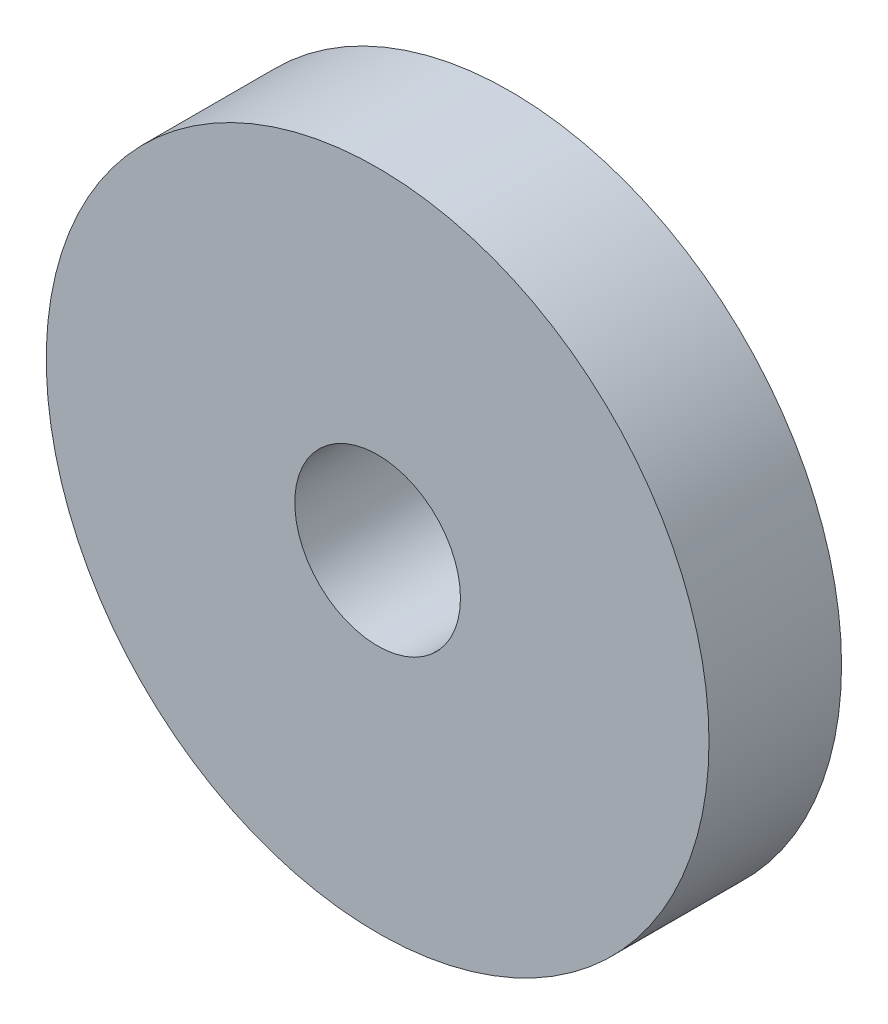
ISO-10303-21;
HEADER;
FILE_DESCRIPTION(('STEP AP214'),'2;1');
FILE_NAME('part.step','',(''),(''),'','','');
FILE_SCHEMA(('AUTOMOTIVE_DESIGN { 1 0 10303 214 1 1 1 1 }'));
ENDSEC;
DATA;
#1=APPLICATION_CONTEXT('core data for automotive mechanical design processes');
#2=APPLICATION_PROTOCOL_DEFINITION('international standard','automotive_design',2000,#1);
#3=PRODUCT_CONTEXT('',#1,'mechanical');
#4=PRODUCT('Part','Part','',(#3));
#5=PRODUCT_RELATED_PRODUCT_CATEGORY('part','',(#4));
#6=PRODUCT_DEFINITION_FORMATION('','',#4);
#7=PRODUCT_DEFINITION_CONTEXT('part definition',#1,'design');
#8=PRODUCT_DEFINITION('design','',#6,#7);
#9=PRODUCT_DEFINITION_SHAPE('','',#8);
#10=(LENGTH_UNIT() NAMED_UNIT(*) SI_UNIT(.MILLI.,.METRE.));
#11=(NAMED_UNIT(*) PLANE_ANGLE_UNIT() SI_UNIT($,.RADIAN.));
#12=(NAMED_UNIT(*) SI_UNIT($,.STERADIAN.) SOLID_ANGLE_UNIT());
#13=UNCERTAINTY_MEASURE_WITH_UNIT(LENGTH_MEASURE(1.E-05),#10,'distance_accuracy_value','');
#14=(GEOMETRIC_REPRESENTATION_CONTEXT(3) GLOBAL_UNCERTAINTY_ASSIGNED_CONTEXT((#13)) GLOBAL_UNIT_ASSIGNED_CONTEXT((#10,
#11,#12)) REPRESENTATION_CONTEXT('',''));
#15=CARTESIAN_POINT('',(0.,0.,0.));
#16=DIRECTION('',(0.,0.,1.));
#17=DIRECTION('',(1.,0.,0.));
#18=AXIS2_PLACEMENT_3D('',#15,#16,#17);
#19=CARTESIAN_POINT('',(0.,0.,54.));
#20=DIRECTION('',(0.,0.,1.));
#21=DIRECTION('',(1.,0.,0.));
#22=AXIS2_PLACEMENT_3D('',#19,#20,#21);
#23=PLANE('',#22);
#24=CARTESIAN_POINT('',(0.,0.,54.));
#25=DIRECTION('',(0.,0.,1.));
#26=DIRECTION('',(1.,0.,0.));
#27=AXIS2_PLACEMENT_3D('',#24,#25,#26);
#28=CIRCLE('',#27,10.);
#29=CARTESIAN_POINT('',(10.,0.,54.));
#30=VERTEX_POINT('',#29);
#31=EDGE_CURVE('E10',#30,#30,#28,.T.);
#32=ORIENTED_EDGE('',*,*,#31,.T.);
#33=EDGE_LOOP('',(#32));
#34=FACE_BOUND('',#33,.T.);
#35=CARTESIAN_POINT('',(0.,0.,54.));
#36=DIRECTION('',(0.,0.,1.));
#37=DIRECTION('',(1.,0.,0.));
#38=AXIS2_PLACEMENT_3D('',#35,#36,#37);
#39=CIRCLE('',#38,2.5);
#40=CARTESIAN_POINT('',(2.5,0.,54.));
#41=VERTEX_POINT('',#40);
#42=EDGE_CURVE('E48',#41,#41,#39,.T.);
#43=ORIENTED_EDGE('',*,*,#42,.F.);
#44=EDGE_LOOP('',(#43));
#45=FACE_BOUND('',#44,.T.);
#46=ADVANCED_FACE('F37',(#34,#45),#23,.T.);
#47=CARTESIAN_POINT('',(0.,0.,50.));
#48=DIRECTION('',(0.,0.,1.));
#49=DIRECTION('',(1.,0.,0.));
#50=AXIS2_PLACEMENT_3D('',#47,#48,#49);
#51=PLANE('',#50);
#52=CARTESIAN_POINT('',(0.,0.,50.));
#53=DIRECTION('',(0.,0.,1.));
#54=DIRECTION('',(1.,0.,0.));
#55=AXIS2_PLACEMENT_3D('',#52,#53,#54);
#56=CIRCLE('',#55,10.);
#57=CARTESIAN_POINT('',(10.,0.,50.));
#58=VERTEX_POINT('',#57);
#59=EDGE_CURVE('E41',#58,#58,#56,.T.);
#60=ORIENTED_EDGE('',*,*,#59,.F.);
#61=EDGE_LOOP('',(#60));
#62=FACE_BOUND('',#61,.T.);
#63=CARTESIAN_POINT('',(0.,0.,50.));
#64=DIRECTION('',(0.,0.,1.));
#65=DIRECTION('',(1.,0.,0.));
#66=AXIS2_PLACEMENT_3D('',#63,#64,#65);
#67=CIRCLE('',#66,2.5);
#68=CARTESIAN_POINT('',(2.5,0.,50.));
#69=VERTEX_POINT('',#68);
#70=EDGE_CURVE('E50',#69,#69,#67,.T.);
#71=ORIENTED_EDGE('',*,*,#70,.T.);
#72=EDGE_LOOP('',(#71));
#73=FACE_BOUND('',#72,.T.);
#74=ADVANCED_FACE('F60',(#62,#73),#51,.F.);
#75=CARTESIAN_POINT('',(0.,0.,54.));
#76=DIRECTION('',(0.,0.,-1.));
#77=DIRECTION('',(-1.,0.,0.));
#78=AXIS2_PLACEMENT_3D('',#75,#76,#77);
#79=CYLINDRICAL_SURFACE('',#78,10.);
#80=ORIENTED_EDGE('',*,*,#31,.F.);
#81=EDGE_LOOP('',(#80));
#82=FACE_BOUND('',#81,.T.);
#83=ORIENTED_EDGE('',*,*,#59,.T.);
#84=EDGE_LOOP('',(#83));
#85=FACE_BOUND('',#84,.T.);
#86=ADVANCED_FACE('F39',(#82,#85),#79,.T.);
#87=CARTESIAN_POINT('',(0.,0.,54.));
#88=DIRECTION('',(0.,0.,-1.));
#89=DIRECTION('',(-1.,0.,0.));
#90=AXIS2_PLACEMENT_3D('',#87,#88,#89);
#91=CYLINDRICAL_SURFACE('',#90,2.5);
#92=ORIENTED_EDGE('',*,*,#42,.T.);
#93=EDGE_LOOP('',(#92));
#94=FACE_BOUND('',#93,.T.);
#95=ORIENTED_EDGE('',*,*,#70,.F.);
#96=EDGE_LOOP('',(#95));
#97=FACE_BOUND('',#96,.T.);
#98=ADVANCED_FACE('F56',(#94,#97),#91,.F.);
#99=CLOSED_SHELL('',(#46,#74,#86,#98));
#100=MANIFOLD_SOLID_BREP('B2',#99);
#101=ADVANCED_BREP_SHAPE_REPRESENTATION('',(#18,#100),#14);
#102=SHAPE_DEFINITION_REPRESENTATION(#9,#101);
ENDSEC;
END-ISO-10303-21;
